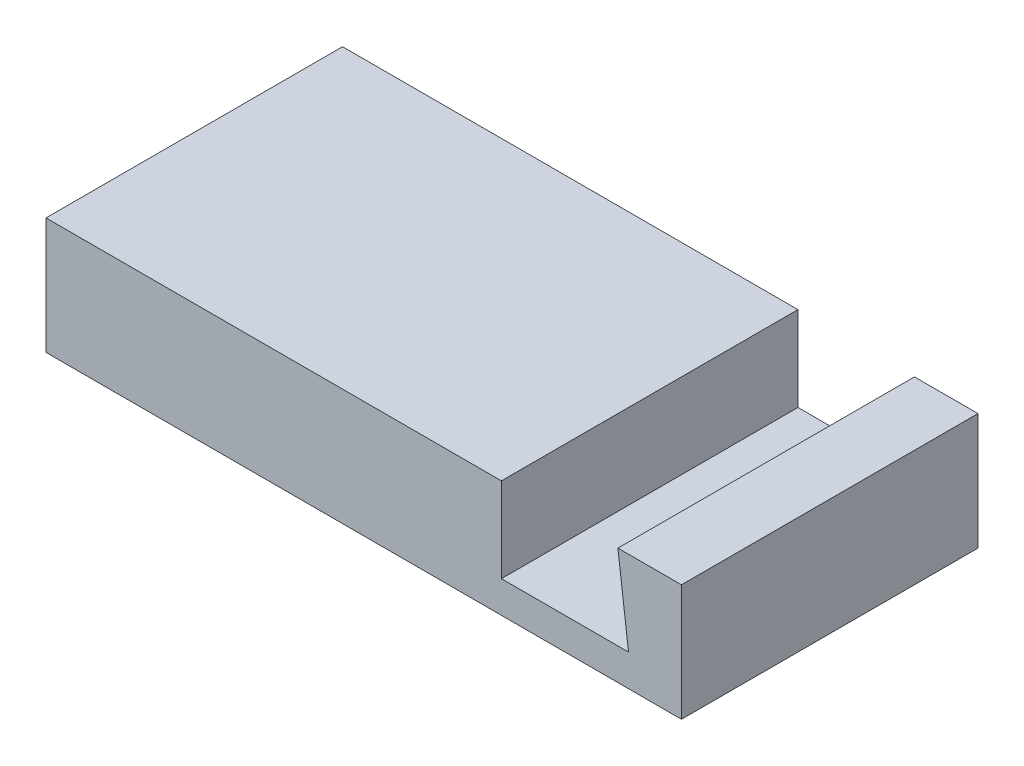
ISO-10303-21;
HEADER;
FILE_DESCRIPTION(('STEP AP214'),'2;1');
FILE_NAME('part.step','',(''),(''),'','','');
FILE_SCHEMA(('AUTOMOTIVE_DESIGN { 1 0 10303 214 1 1 1 1 }'));
ENDSEC;
DATA;
#1=APPLICATION_CONTEXT('core data for automotive mechanical design processes');
#2=APPLICATION_PROTOCOL_DEFINITION('international standard','automotive_design',2000,#1);
#3=PRODUCT_CONTEXT('',#1,'mechanical');
#4=PRODUCT('Part','Part','',(#3));
#5=PRODUCT_RELATED_PRODUCT_CATEGORY('part','',(#4));
#6=PRODUCT_DEFINITION_FORMATION('','',#4);
#7=PRODUCT_DEFINITION_CONTEXT('part definition',#1,'design');
#8=PRODUCT_DEFINITION('design','',#6,#7);
#9=PRODUCT_DEFINITION_SHAPE('','',#8);
#10=(LENGTH_UNIT() NAMED_UNIT(*) SI_UNIT(.MILLI.,.METRE.));
#11=(NAMED_UNIT(*) PLANE_ANGLE_UNIT() SI_UNIT($,.RADIAN.));
#12=(NAMED_UNIT(*) SI_UNIT($,.STERADIAN.) SOLID_ANGLE_UNIT());
#13=UNCERTAINTY_MEASURE_WITH_UNIT(LENGTH_MEASURE(1.E-05),#10,'distance_accuracy_value','');
#14=(GEOMETRIC_REPRESENTATION_CONTEXT(3) GLOBAL_UNCERTAINTY_ASSIGNED_CONTEXT((#13)) GLOBAL_UNIT_ASSIGNED_CONTEXT((#10,
#11,#12)) REPRESENTATION_CONTEXT('',''));
#15=CARTESIAN_POINT('',(0.,0.,0.));
#16=DIRECTION('',(0.,0.,1.));
#17=DIRECTION('',(1.,0.,0.));
#18=AXIS2_PLACEMENT_3D('',#15,#16,#17);
#19=CARTESIAN_POINT('',(0.,11.,28.));
#20=DIRECTION('',(1.,0.,0.));
#21=DIRECTION('',(0.,1.,0.));
#22=AXIS2_PLACEMENT_3D('',#19,#20,#21);
#23=PLANE('',#22);
#24=DIRECTION('',(0.,-1.,0.));
#25=VECTOR('',#24,1.);
#26=CARTESIAN_POINT('',(0.,11.,0.));
#27=LINE('',#26,#25);
#28=CARTESIAN_POINT('',(0.,11.,0.));
#29=VERTEX_POINT('',#28);
#30=CARTESIAN_POINT('',(0.,0.,0.));
#31=VERTEX_POINT('',#30);
#32=EDGE_CURVE('E144',#29,#31,#27,.T.);
#33=ORIENTED_EDGE('',*,*,#32,.T.);
#34=DIRECTION('',(0.,0.,-1.));
#35=VECTOR('',#34,1.);
#36=CARTESIAN_POINT('',(0.,0.,28.));
#37=LINE('',#36,#35);
#38=CARTESIAN_POINT('',(0.,0.,28.));
#39=VERTEX_POINT('',#38);
#40=EDGE_CURVE('E11',#39,#31,#37,.T.);
#41=ORIENTED_EDGE('',*,*,#40,.F.);
#42=DIRECTION('',(0.,-1.,0.));
#43=VECTOR('',#42,1.);
#44=CARTESIAN_POINT('',(0.,11.,28.));
#45=LINE('',#44,#43);
#46=CARTESIAN_POINT('',(0.,11.,28.));
#47=VERTEX_POINT('',#46);
#48=EDGE_CURVE('E166',#47,#39,#45,.T.);
#49=ORIENTED_EDGE('',*,*,#48,.F.);
#50=DIRECTION('',(0.,0.,-1.));
#51=VECTOR('',#50,1.);
#52=CARTESIAN_POINT('',(0.,11.,28.));
#53=LINE('',#52,#51);
#54=EDGE_CURVE('E140',#47,#29,#53,.T.);
#55=ORIENTED_EDGE('',*,*,#54,.T.);
#56=EDGE_LOOP('',(#33,#41,#49,#55));
#57=FACE_BOUND('',#56,.T.);
#58=ADVANCED_FACE('F43',(#57),#23,.F.);
#59=CARTESIAN_POINT('',(0.,0.,28.));
#60=DIRECTION('',(0.,1.,0.));
#61=DIRECTION('',(0.,0.,1.));
#62=AXIS2_PLACEMENT_3D('',#59,#60,#61);
#63=PLANE('',#62);
#64=DIRECTION('',(1.,0.,0.));
#65=VECTOR('',#64,1.);
#66=CARTESIAN_POINT('',(0.,0.,0.));
#67=LINE('',#66,#65);
#68=CARTESIAN_POINT('',(60.,0.,0.));
#69=VERTEX_POINT('',#68);
#70=EDGE_CURVE('E148',#31,#69,#67,.T.);
#71=ORIENTED_EDGE('',*,*,#70,.T.);
#72=DIRECTION('',(0.,0.,-1.));
#73=VECTOR('',#72,1.);
#74=CARTESIAN_POINT('',(60.,0.,28.));
#75=LINE('',#74,#73);
#76=CARTESIAN_POINT('',(60.,0.,28.));
#77=VERTEX_POINT('',#76);
#78=EDGE_CURVE('E52',#77,#69,#75,.T.);
#79=ORIENTED_EDGE('',*,*,#78,.F.);
#80=DIRECTION('',(1.,0.,0.));
#81=VECTOR('',#80,1.);
#82=CARTESIAN_POINT('',(0.,0.,28.));
#83=LINE('',#82,#81);
#84=EDGE_CURVE('E103',#39,#77,#83,.T.);
#85=ORIENTED_EDGE('',*,*,#84,.F.);
#86=ORIENTED_EDGE('',*,*,#40,.T.);
#87=EDGE_LOOP('',(#71,#79,#85,#86));
#88=FACE_BOUND('',#87,.T.);
#89=ADVANCED_FACE('F212',(#88),#63,.F.);
#90=CARTESIAN_POINT('',(60.,0.,28.));
#91=DIRECTION('',(-1.,0.,0.));
#92=DIRECTION('',(0.,0.,1.));
#93=AXIS2_PLACEMENT_3D('',#90,#91,#92);
#94=PLANE('',#93);
#95=DIRECTION('',(0.,1.,0.));
#96=VECTOR('',#95,1.);
#97=CARTESIAN_POINT('',(60.,0.,0.));
#98=LINE('',#97,#96);
#99=CARTESIAN_POINT('',(60.,11.,0.));
#100=VERTEX_POINT('',#99);
#101=EDGE_CURVE('E151',#69,#100,#98,.T.);
#102=ORIENTED_EDGE('',*,*,#101,.T.);
#103=DIRECTION('',(0.,0.,-1.));
#104=VECTOR('',#103,1.);
#105=CARTESIAN_POINT('',(60.,11.,28.));
#106=LINE('',#105,#104);
#107=CARTESIAN_POINT('',(60.,11.,28.));
#108=VERTEX_POINT('',#107);
#109=EDGE_CURVE('E177',#108,#100,#106,.T.);
#110=ORIENTED_EDGE('',*,*,#109,.F.);
#111=DIRECTION('',(0.,1.,0.));
#112=VECTOR('',#111,1.);
#113=CARTESIAN_POINT('',(60.,0.,28.));
#114=LINE('',#113,#112);
#115=EDGE_CURVE('E187',#77,#108,#114,.T.);
#116=ORIENTED_EDGE('',*,*,#115,.F.);
#117=ORIENTED_EDGE('',*,*,#78,.T.);
#118=EDGE_LOOP('',(#102,#110,#116,#117));
#119=FACE_BOUND('',#118,.T.);
#120=ADVANCED_FACE('F185',(#119),#94,.F.);
#121=CARTESIAN_POINT('',(60.,11.,28.));
#122=DIRECTION('',(0.,-1.,0.));
#123=DIRECTION('',(1.,0.,0.));
#124=AXIS2_PLACEMENT_3D('',#121,#122,#123);
#125=PLANE('',#124);
#126=DIRECTION('',(-1.,0.,0.));
#127=VECTOR('',#126,1.);
#128=CARTESIAN_POINT('',(60.,11.,0.));
#129=LINE('',#128,#127);
#130=CARTESIAN_POINT('',(54.,11.,0.));
#131=VERTEX_POINT('',#130);
#132=EDGE_CURVE('E154',#100,#131,#129,.T.);
#133=ORIENTED_EDGE('',*,*,#132,.T.);
#134=DIRECTION('',(0.,0.,-1.));
#135=VECTOR('',#134,1.);
#136=CARTESIAN_POINT('',(54.,11.,28.));
#137=LINE('',#136,#135);
#138=CARTESIAN_POINT('',(54.,11.,28.));
#139=VERTEX_POINT('',#138);
#140=EDGE_CURVE('E173',#139,#131,#137,.T.);
#141=ORIENTED_EDGE('',*,*,#140,.F.);
#142=DIRECTION('',(-1.,0.,0.));
#143=VECTOR('',#142,1.);
#144=CARTESIAN_POINT('',(60.,11.,28.));
#145=LINE('',#144,#143);
#146=EDGE_CURVE('E200',#108,#139,#145,.T.);
#147=ORIENTED_EDGE('',*,*,#146,.F.);
#148=ORIENTED_EDGE('',*,*,#109,.T.);
#149=EDGE_LOOP('',(#133,#141,#147,#148));
#150=FACE_BOUND('',#149,.T.);
#151=ADVANCED_FACE('F195',(#150),#125,.F.);
#152=CARTESIAN_POINT('',(54.,11.,28.));
#153=DIRECTION('',(0.992277876713668,0.124034734589207,0.));
#154=DIRECTION('',(-0.124034734589207,0.992277876713668,0.));
#155=AXIS2_PLACEMENT_3D('',#152,#153,#154);
#156=PLANE('',#155);
#157=DIRECTION('',(0.124034734589207,-0.992277876713668,0.));
#158=VECTOR('',#157,1.);
#159=CARTESIAN_POINT('',(54.,11.,0.));
#160=LINE('',#159,#158);
#161=CARTESIAN_POINT('',(55.,3.,0.));
#162=VERTEX_POINT('',#161);
#163=EDGE_CURVE('E157',#131,#162,#160,.T.);
#164=ORIENTED_EDGE('',*,*,#163,.T.);
#165=DIRECTION('',(0.,0.,-1.));
#166=VECTOR('',#165,1.);
#167=CARTESIAN_POINT('',(55.,3.,28.));
#168=LINE('',#167,#166);
#169=CARTESIAN_POINT('',(55.,3.,28.));
#170=VERTEX_POINT('',#169);
#171=EDGE_CURVE('E133',#170,#162,#168,.T.);
#172=ORIENTED_EDGE('',*,*,#171,.F.);
#173=DIRECTION('',(0.124034734589207,-0.992277876713668,0.));
#174=VECTOR('',#173,1.);
#175=CARTESIAN_POINT('',(54.,11.,28.));
#176=LINE('',#175,#174);
#177=EDGE_CURVE('E122',#139,#170,#176,.T.);
#178=ORIENTED_EDGE('',*,*,#177,.F.);
#179=ORIENTED_EDGE('',*,*,#140,.T.);
#180=EDGE_LOOP('',(#164,#172,#178,#179));
#181=FACE_BOUND('',#180,.T.);
#182=ADVANCED_FACE('F198',(#181),#156,.F.);
#183=CARTESIAN_POINT('',(55.,3.,28.));
#184=DIRECTION('',(0.,-1.,0.));
#185=DIRECTION('',(1.,0.,0.));
#186=AXIS2_PLACEMENT_3D('',#183,#184,#185);
#187=PLANE('',#186);
#188=DIRECTION('',(-1.,0.,0.));
#189=VECTOR('',#188,1.);
#190=CARTESIAN_POINT('',(55.,3.,0.));
#191=LINE('',#190,#189);
#192=CARTESIAN_POINT('',(43.,3.,0.));
#193=VERTEX_POINT('',#192);
#194=EDGE_CURVE('E131',#162,#193,#191,.T.);
#195=ORIENTED_EDGE('',*,*,#194,.T.);
#196=DIRECTION('',(0.,0.,-1.));
#197=VECTOR('',#196,1.);
#198=CARTESIAN_POINT('',(43.,3.,28.));
#199=LINE('',#198,#197);
#200=CARTESIAN_POINT('',(43.,3.,28.));
#201=VERTEX_POINT('',#200);
#202=EDGE_CURVE('E128',#201,#193,#199,.T.);
#203=ORIENTED_EDGE('',*,*,#202,.F.);
#204=DIRECTION('',(-1.,0.,0.));
#205=VECTOR('',#204,1.);
#206=CARTESIAN_POINT('',(55.,3.,28.));
#207=LINE('',#206,#205);
#208=EDGE_CURVE('E116',#170,#201,#207,.T.);
#209=ORIENTED_EDGE('',*,*,#208,.F.);
#210=ORIENTED_EDGE('',*,*,#171,.T.);
#211=EDGE_LOOP('',(#195,#203,#209,#210));
#212=FACE_BOUND('',#211,.T.);
#213=ADVANCED_FACE('F129',(#212),#187,.F.);
#214=CARTESIAN_POINT('',(43.,3.,28.));
#215=DIRECTION('',(-1.,0.,0.));
#216=DIRECTION('',(0.,0.,1.));
#217=AXIS2_PLACEMENT_3D('',#214,#215,#216);
#218=PLANE('',#217);
#219=DIRECTION('',(0.,1.,0.));
#220=VECTOR('',#219,1.);
#221=CARTESIAN_POINT('',(43.,3.,0.));
#222=LINE('',#221,#220);
#223=CARTESIAN_POINT('',(43.,11.,0.));
#224=VERTEX_POINT('',#223);
#225=EDGE_CURVE('E89',#193,#224,#222,.T.);
#226=ORIENTED_EDGE('',*,*,#225,.T.);
#227=DIRECTION('',(0.,0.,-1.));
#228=VECTOR('',#227,1.);
#229=CARTESIAN_POINT('',(43.,11.,28.));
#230=LINE('',#229,#228);
#231=CARTESIAN_POINT('',(43.,11.,28.));
#232=VERTEX_POINT('',#231);
#233=EDGE_CURVE('E134',#232,#224,#230,.T.);
#234=ORIENTED_EDGE('',*,*,#233,.F.);
#235=DIRECTION('',(0.,1.,0.));
#236=VECTOR('',#235,1.);
#237=CARTESIAN_POINT('',(43.,3.,28.));
#238=LINE('',#237,#236);
#239=EDGE_CURVE('E120',#201,#232,#238,.T.);
#240=ORIENTED_EDGE('',*,*,#239,.F.);
#241=ORIENTED_EDGE('',*,*,#202,.T.);
#242=EDGE_LOOP('',(#226,#234,#240,#241));
#243=FACE_BOUND('',#242,.T.);
#244=ADVANCED_FACE('F136',(#243),#218,.F.);
#245=CARTESIAN_POINT('',(43.,11.,28.));
#246=DIRECTION('',(0.,-1.,0.));
#247=DIRECTION('',(1.,0.,0.));
#248=AXIS2_PLACEMENT_3D('',#245,#246,#247);
#249=PLANE('',#248);
#250=DIRECTION('',(-1.,0.,0.));
#251=VECTOR('',#250,1.);
#252=CARTESIAN_POINT('',(43.,11.,0.));
#253=LINE('',#252,#251);
#254=EDGE_CURVE('E95',#224,#29,#253,.T.);
#255=ORIENTED_EDGE('',*,*,#254,.T.);
#256=ORIENTED_EDGE('',*,*,#54,.F.);
#257=DIRECTION('',(-1.,0.,0.));
#258=VECTOR('',#257,1.);
#259=CARTESIAN_POINT('',(43.,11.,28.));
#260=LINE('',#259,#258);
#261=EDGE_CURVE('E60',#232,#47,#260,.T.);
#262=ORIENTED_EDGE('',*,*,#261,.F.);
#263=ORIENTED_EDGE('',*,*,#233,.T.);
#264=EDGE_LOOP('',(#255,#256,#262,#263));
#265=FACE_BOUND('',#264,.T.);
#266=ADVANCED_FACE('F228',(#265),#249,.F.);
#267=CARTESIAN_POINT('',(0.,0.,28.));
#268=DIRECTION('',(0.,0.,1.));
#269=DIRECTION('',(1.,0.,0.));
#270=AXIS2_PLACEMENT_3D('',#267,#268,#269);
#271=PLANE('',#270);
#272=ORIENTED_EDGE('',*,*,#48,.T.);
#273=ORIENTED_EDGE('',*,*,#84,.T.);
#274=ORIENTED_EDGE('',*,*,#115,.T.);
#275=ORIENTED_EDGE('',*,*,#146,.T.);
#276=ORIENTED_EDGE('',*,*,#177,.T.);
#277=ORIENTED_EDGE('',*,*,#208,.T.);
#278=ORIENTED_EDGE('',*,*,#239,.T.);
#279=ORIENTED_EDGE('',*,*,#261,.T.);
#280=EDGE_LOOP('',(#272,#273,#274,#275,#276,#277,#278,#279));
#281=FACE_BOUND('',#280,.T.);
#282=ADVANCED_FACE('F118',(#281),#271,.T.);
#283=CARTESIAN_POINT('',(0.,0.,0.));
#284=DIRECTION('',(0.,0.,1.));
#285=DIRECTION('',(1.,0.,0.));
#286=AXIS2_PLACEMENT_3D('',#283,#284,#285);
#287=PLANE('',#286);
#288=ORIENTED_EDGE('',*,*,#32,.F.);
#289=ORIENTED_EDGE('',*,*,#254,.F.);
#290=ORIENTED_EDGE('',*,*,#225,.F.);
#291=ORIENTED_EDGE('',*,*,#194,.F.);
#292=ORIENTED_EDGE('',*,*,#163,.F.);
#293=ORIENTED_EDGE('',*,*,#132,.F.);
#294=ORIENTED_EDGE('',*,*,#101,.F.);
#295=ORIENTED_EDGE('',*,*,#70,.F.);
#296=EDGE_LOOP('',(#288,#289,#290,#291,#292,#293,#294,#295));
#297=FACE_BOUND('',#296,.T.);
#298=ADVANCED_FACE('F191',(#297),#287,.F.);
#299=CLOSED_SHELL('',(#58,#89,#120,#151,#182,#213,#244,#266,#282,#298));
#300=MANIFOLD_SOLID_BREP('B2',#299);
#301=ADVANCED_BREP_SHAPE_REPRESENTATION('',(#18,#300),#14);
#302=SHAPE_DEFINITION_REPRESENTATION(#9,#301);
ENDSEC;
END-ISO-10303-21;
